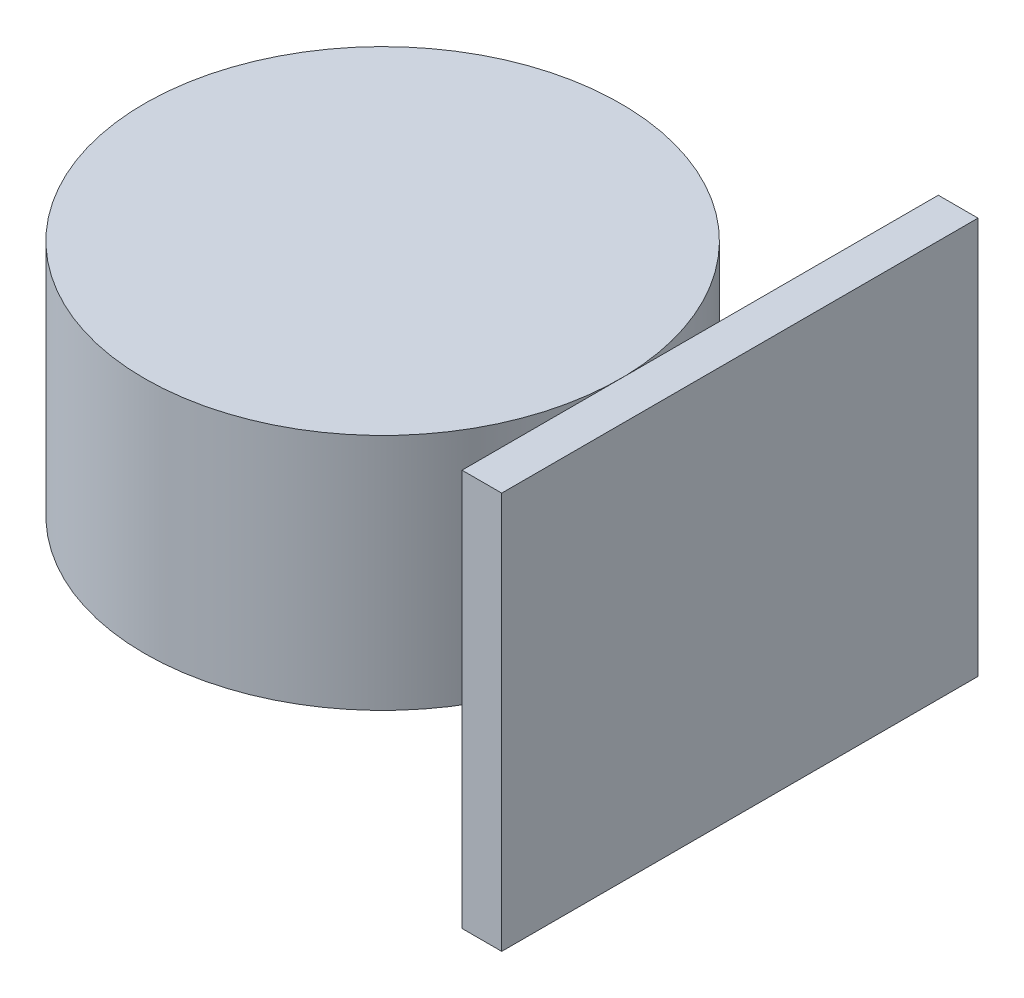
ISO-10303-21;
HEADER;
FILE_DESCRIPTION(('STEP AP214'),'2;1');
FILE_NAME('part.step','',(''),(''),'','','');
FILE_SCHEMA(('AUTOMOTIVE_DESIGN { 1 0 10303 214 1 1 1 1 }'));
ENDSEC;
DATA;
#1=APPLICATION_CONTEXT('core data for automotive mechanical design processes');
#2=APPLICATION_PROTOCOL_DEFINITION('international standard','automotive_design',2000,#1);
#3=PRODUCT_CONTEXT('',#1,'mechanical');
#4=PRODUCT('Part','Part','',(#3));
#5=PRODUCT_RELATED_PRODUCT_CATEGORY('part','',(#4));
#6=PRODUCT_DEFINITION_FORMATION('','',#4);
#7=PRODUCT_DEFINITION_CONTEXT('part definition',#1,'design');
#8=PRODUCT_DEFINITION('design','',#6,#7);
#9=PRODUCT_DEFINITION_SHAPE('','',#8);
#10=(LENGTH_UNIT() NAMED_UNIT(*) SI_UNIT(.MILLI.,.METRE.));
#11=(NAMED_UNIT(*) PLANE_ANGLE_UNIT() SI_UNIT($,.RADIAN.));
#12=(NAMED_UNIT(*) SI_UNIT($,.STERADIAN.) SOLID_ANGLE_UNIT());
#13=UNCERTAINTY_MEASURE_WITH_UNIT(LENGTH_MEASURE(1.E-05),#10,'distance_accuracy_value','');
#14=(GEOMETRIC_REPRESENTATION_CONTEXT(3) GLOBAL_UNCERTAINTY_ASSIGNED_CONTEXT((#13)) GLOBAL_UNIT_ASSIGNED_CONTEXT((#10,
#11,#12)) REPRESENTATION_CONTEXT('',''));
#15=CARTESIAN_POINT('',(0.,0.,0.));
#16=DIRECTION('',(0.,0.,1.));
#17=DIRECTION('',(1.,0.,0.));
#18=AXIS2_PLACEMENT_3D('',#15,#16,#17);
#19=CARTESIAN_POINT('',(0.,15.,0.));
#20=DIRECTION('',(0.,-1.,0.));
#21=DIRECTION('',(0.,0.,-1.));
#22=AXIS2_PLACEMENT_3D('',#19,#20,#21);
#23=CYLINDRICAL_SURFACE('',#22,30.);
#24=CARTESIAN_POINT('',(0.,-15.,0.));
#25=DIRECTION('',(0.,1.,0.));
#26=DIRECTION('',(0.,0.,1.));
#27=AXIS2_PLACEMENT_3D('',#24,#25,#26);
#28=CIRCLE('',#27,30.);
#29=CARTESIAN_POINT('',(0.,-15.,30.));
#30=VERTEX_POINT('',#29);
#31=EDGE_CURVE('E153',#30,#30,#28,.T.);
#32=ORIENTED_EDGE('',*,*,#31,.T.);
#33=EDGE_LOOP('',(#32));
#34=FACE_BOUND('',#33,.T.);
#35=CARTESIAN_POINT('',(0.,15.,0.));
#36=DIRECTION('',(0.,1.,0.));
#37=DIRECTION('',(0.,0.,1.));
#38=AXIS2_PLACEMENT_3D('',#35,#36,#37);
#39=CIRCLE('',#38,30.);
#40=CARTESIAN_POINT('',(0.,15.,30.));
#41=VERTEX_POINT('',#40);
#42=EDGE_CURVE('E154',#41,#41,#39,.T.);
#43=ORIENTED_EDGE('',*,*,#42,.F.);
#44=EDGE_LOOP('',(#43));
#45=FACE_BOUND('',#44,.T.);
#46=DIRECTION('',(0.,-1.,0.));
#47=VECTOR('',#46,1.);
#48=CARTESIAN_POINT('',(28.2842712474619,15.,-10.));
#49=LINE('',#48,#47);
#50=CARTESIAN_POINT('',(28.2842712474619,-10.,-10.));
#51=VERTEX_POINT('',#50);
#52=CARTESIAN_POINT('',(28.2842712474619,10.,-10.));
#53=VERTEX_POINT('',#52);
#54=EDGE_CURVE('E11',#51,#53,#49,.F.);
#55=ORIENTED_EDGE('',*,*,#54,.F.);
#56=CARTESIAN_POINT('',(0.,-10.,0.));
#57=DIRECTION('',(0.,1.,0.));
#58=DIRECTION('',(0.,0.,1.));
#59=AXIS2_PLACEMENT_3D('',#56,#57,#58);
#60=CIRCLE('',#59,30.);
#61=CARTESIAN_POINT('',(28.2842712474619,-10.,10.));
#62=VERTEX_POINT('',#61);
#63=EDGE_CURVE('E157',#62,#51,#60,.T.);
#64=ORIENTED_EDGE('',*,*,#63,.F.);
#65=DIRECTION('',(0.,-1.,0.));
#66=VECTOR('',#65,1.);
#67=CARTESIAN_POINT('',(28.2842712474619,15.,10.));
#68=LINE('',#67,#66);
#69=CARTESIAN_POINT('',(28.2842712474619,10.,10.));
#70=VERTEX_POINT('',#69);
#71=EDGE_CURVE('E56',#70,#62,#68,.T.);
#72=ORIENTED_EDGE('',*,*,#71,.F.);
#73=CARTESIAN_POINT('',(0.,10.,0.));
#74=DIRECTION('',(0.,-1.,0.));
#75=DIRECTION('',(0.,0.,-1.));
#76=AXIS2_PLACEMENT_3D('',#73,#74,#75);
#77=CIRCLE('',#76,30.);
#78=EDGE_CURVE('E46',#53,#70,#77,.T.);
#79=ORIENTED_EDGE('',*,*,#78,.F.);
#80=EDGE_LOOP('',(#55,#64,#72,#79));
#81=FACE_BOUND('',#80,.T.);
#82=ADVANCED_FACE('F39',(#34,#45,#81),#23,.T.);
#83=CARTESIAN_POINT('',(0.,15.,0.));
#84=DIRECTION('',(0.,1.,0.));
#85=DIRECTION('',(0.,0.,1.));
#86=AXIS2_PLACEMENT_3D('',#83,#84,#85);
#87=PLANE('',#86);
#88=ORIENTED_EDGE('',*,*,#42,.T.);
#89=EDGE_LOOP('',(#88));
#90=FACE_BOUND('',#89,.T.);
#91=ADVANCED_FACE('F187',(#90),#87,.T.);
#92=CARTESIAN_POINT('',(0.,-15.,0.));
#93=DIRECTION('',(0.,1.,0.));
#94=DIRECTION('',(0.,0.,1.));
#95=AXIS2_PLACEMENT_3D('',#92,#93,#94);
#96=PLANE('',#95);
#97=ORIENTED_EDGE('',*,*,#31,.F.);
#98=EDGE_LOOP('',(#97));
#99=FACE_BOUND('',#98,.T.);
#100=ADVANCED_FACE('F194',(#99),#96,.F.);
#101=CARTESIAN_POINT('',(40.,-10.,-10.));
#102=DIRECTION('',(0.,0.,1.));
#103=DIRECTION('',(1.,0.,0.));
#104=AXIS2_PLACEMENT_3D('',#101,#102,#103);
#105=PLANE('',#104);
#106=DIRECTION('',(-1.,0.,0.));
#107=VECTOR('',#106,1.);
#108=CARTESIAN_POINT('',(40.,-10.,-10.));
#109=LINE('',#108,#107);
#110=CARTESIAN_POINT('',(40.,-10.,-10.));
#111=VERTEX_POINT('',#110);
#112=EDGE_CURVE('E141',#111,#51,#109,.T.);
#113=ORIENTED_EDGE('',*,*,#112,.T.);
#114=ORIENTED_EDGE('',*,*,#54,.T.);
#115=DIRECTION('',(-1.,0.,0.));
#116=VECTOR('',#115,1.);
#117=CARTESIAN_POINT('',(40.,10.,-10.));
#118=LINE('',#117,#116);
#119=CARTESIAN_POINT('',(40.,10.,-10.));
#120=VERTEX_POINT('',#119);
#121=EDGE_CURVE('E150',#120,#53,#118,.T.);
#122=ORIENTED_EDGE('',*,*,#121,.F.);
#123=DIRECTION('',(0.,1.,0.));
#124=VECTOR('',#123,1.);
#125=CARTESIAN_POINT('',(40.,-10.,-10.));
#126=LINE('',#125,#124);
#127=EDGE_CURVE('E124',#111,#120,#126,.T.);
#128=ORIENTED_EDGE('',*,*,#127,.F.);
#129=EDGE_LOOP('',(#113,#114,#122,#128));
#130=FACE_BOUND('',#129,.T.);
#131=ADVANCED_FACE('F173',(#130),#105,.F.);
#132=CARTESIAN_POINT('',(40.,-10.,10.));
#133=DIRECTION('',(0.,0.,-1.));
#134=DIRECTION('',(-1.,0.,0.));
#135=AXIS2_PLACEMENT_3D('',#132,#133,#134);
#136=PLANE('',#135);
#137=DIRECTION('',(-1.,0.,0.));
#138=VECTOR('',#137,1.);
#139=CARTESIAN_POINT('',(40.,10.,10.));
#140=LINE('',#139,#138);
#141=CARTESIAN_POINT('',(40.,10.,10.));
#142=VERTEX_POINT('',#141);
#143=EDGE_CURVE('E147',#142,#70,#140,.T.);
#144=ORIENTED_EDGE('',*,*,#143,.T.);
#145=ORIENTED_EDGE('',*,*,#71,.T.);
#146=DIRECTION('',(-1.,0.,0.));
#147=VECTOR('',#146,1.);
#148=CARTESIAN_POINT('',(40.,-10.,10.));
#149=LINE('',#148,#147);
#150=CARTESIAN_POINT('',(40.,-10.,10.));
#151=VERTEX_POINT('',#150);
#152=EDGE_CURVE('E144',#151,#62,#149,.T.);
#153=ORIENTED_EDGE('',*,*,#152,.F.);
#154=DIRECTION('',(0.,-1.,0.));
#155=VECTOR('',#154,1.);
#156=CARTESIAN_POINT('',(40.,-10.,10.));
#157=LINE('',#156,#155);
#158=EDGE_CURVE('E135',#142,#151,#157,.T.);
#159=ORIENTED_EDGE('',*,*,#158,.F.);
#160=EDGE_LOOP('',(#144,#145,#153,#159));
#161=FACE_BOUND('',#160,.T.);
#162=ADVANCED_FACE('F167',(#161),#136,.F.);
#163=CARTESIAN_POINT('',(40.,10.,10.));
#164=DIRECTION('',(0.,-1.,0.));
#165=DIRECTION('',(0.,0.,-1.));
#166=AXIS2_PLACEMENT_3D('',#163,#164,#165);
#167=PLANE('',#166);
#168=ORIENTED_EDGE('',*,*,#121,.T.);
#169=ORIENTED_EDGE('',*,*,#78,.T.);
#170=ORIENTED_EDGE('',*,*,#143,.F.);
#171=DIRECTION('',(0.,0.,1.));
#172=VECTOR('',#171,1.);
#173=CARTESIAN_POINT('',(40.,10.,10.));
#174=LINE('',#173,#172);
#175=EDGE_CURVE('E127',#120,#142,#174,.T.);
#176=ORIENTED_EDGE('',*,*,#175,.F.);
#177=EDGE_LOOP('',(#168,#169,#170,#176));
#178=FACE_BOUND('',#177,.T.);
#179=ADVANCED_FACE('F163',(#178),#167,.F.);
#180=CARTESIAN_POINT('',(40.,-10.,10.));
#181=DIRECTION('',(0.,1.,0.));
#182=DIRECTION('',(0.,0.,1.));
#183=AXIS2_PLACEMENT_3D('',#180,#181,#182);
#184=PLANE('',#183);
#185=ORIENTED_EDGE('',*,*,#152,.T.);
#186=ORIENTED_EDGE('',*,*,#63,.T.);
#187=ORIENTED_EDGE('',*,*,#112,.F.);
#188=DIRECTION('',(0.,0.,-1.));
#189=VECTOR('',#188,1.);
#190=CARTESIAN_POINT('',(40.,-10.,10.));
#191=LINE('',#190,#189);
#192=EDGE_CURVE('E138',#151,#111,#191,.T.);
#193=ORIENTED_EDGE('',*,*,#192,.F.);
#194=EDGE_LOOP('',(#185,#186,#187,#193));
#195=FACE_BOUND('',#194,.T.);
#196=ADVANCED_FACE('F176',(#195),#184,.F.);
#197=CARTESIAN_POINT('',(45.,-25.,-30.));
#198=DIRECTION('',(0.,0.,1.));
#199=DIRECTION('',(1.,0.,0.));
#200=AXIS2_PLACEMENT_3D('',#197,#198,#199);
#201=PLANE('',#200);
#202=DIRECTION('',(0.,1.,0.));
#203=VECTOR('',#202,1.);
#204=CARTESIAN_POINT('',(40.,-25.,-30.));
#205=LINE('',#204,#203);
#206=CARTESIAN_POINT('',(40.,-25.,-30.));
#207=VERTEX_POINT('',#206);
#208=CARTESIAN_POINT('',(40.,25.,-30.));
#209=VERTEX_POINT('',#208);
#210=EDGE_CURVE('E123',#207,#209,#205,.T.);
#211=ORIENTED_EDGE('',*,*,#210,.T.);
#212=DIRECTION('',(-1.,0.,0.));
#213=VECTOR('',#212,1.);
#214=CARTESIAN_POINT('',(45.,25.,-30.));
#215=LINE('',#214,#213);
#216=CARTESIAN_POINT('',(45.,25.,-30.));
#217=VERTEX_POINT('',#216);
#218=EDGE_CURVE('E103',#217,#209,#215,.T.);
#219=ORIENTED_EDGE('',*,*,#218,.F.);
#220=DIRECTION('',(0.,1.,0.));
#221=VECTOR('',#220,1.);
#222=CARTESIAN_POINT('',(45.,-25.,-30.));
#223=LINE('',#222,#221);
#224=CARTESIAN_POINT('',(45.,-25.,-30.));
#225=VERTEX_POINT('',#224);
#226=EDGE_CURVE('E110',#225,#217,#223,.T.);
#227=ORIENTED_EDGE('',*,*,#226,.F.);
#228=DIRECTION('',(-1.,0.,0.));
#229=VECTOR('',#228,1.);
#230=CARTESIAN_POINT('',(45.,-25.,-30.));
#231=LINE('',#230,#229);
#232=EDGE_CURVE('E274',#225,#207,#231,.T.);
#233=ORIENTED_EDGE('',*,*,#232,.T.);
#234=EDGE_LOOP('',(#211,#219,#227,#233));
#235=FACE_BOUND('',#234,.T.);
#236=ADVANCED_FACE('F121',(#235),#201,.F.);
#237=CARTESIAN_POINT('',(45.,25.,30.));
#238=DIRECTION('',(0.,-1.,0.));
#239=DIRECTION('',(0.,0.,-1.));
#240=AXIS2_PLACEMENT_3D('',#237,#238,#239);
#241=PLANE('',#240);
#242=DIRECTION('',(0.,0.,1.));
#243=VECTOR('',#242,1.);
#244=CARTESIAN_POINT('',(40.,25.,30.));
#245=LINE('',#244,#243);
#246=CARTESIAN_POINT('',(40.,25.,30.));
#247=VERTEX_POINT('',#246);
#248=EDGE_CURVE('E280',#209,#247,#245,.T.);
#249=ORIENTED_EDGE('',*,*,#248,.T.);
#250=DIRECTION('',(-1.,0.,0.));
#251=VECTOR('',#250,1.);
#252=CARTESIAN_POINT('',(45.,25.,30.));
#253=LINE('',#252,#251);
#254=CARTESIAN_POINT('',(45.,25.,30.));
#255=VERTEX_POINT('',#254);
#256=EDGE_CURVE('E106',#255,#247,#253,.T.);
#257=ORIENTED_EDGE('',*,*,#256,.F.);
#258=DIRECTION('',(0.,0.,1.));
#259=VECTOR('',#258,1.);
#260=CARTESIAN_POINT('',(45.,25.,30.));
#261=LINE('',#260,#259);
#262=EDGE_CURVE('E99',#217,#255,#261,.T.);
#263=ORIENTED_EDGE('',*,*,#262,.F.);
#264=ORIENTED_EDGE('',*,*,#218,.T.);
#265=EDGE_LOOP('',(#249,#257,#263,#264));
#266=FACE_BOUND('',#265,.T.);
#267=ADVANCED_FACE('F101',(#266),#241,.F.);
#268=CARTESIAN_POINT('',(45.,-25.,30.));
#269=DIRECTION('',(0.,0.,-1.));
#270=DIRECTION('',(-1.,0.,0.));
#271=AXIS2_PLACEMENT_3D('',#268,#269,#270);
#272=PLANE('',#271);
#273=DIRECTION('',(0.,-1.,0.));
#274=VECTOR('',#273,1.);
#275=CARTESIAN_POINT('',(40.,-25.,30.));
#276=LINE('',#275,#274);
#277=CARTESIAN_POINT('',(40.,-25.,30.));
#278=VERTEX_POINT('',#277);
#279=EDGE_CURVE('E277',#247,#278,#276,.T.);
#280=ORIENTED_EDGE('',*,*,#279,.T.);
#281=DIRECTION('',(-1.,0.,0.));
#282=VECTOR('',#281,1.);
#283=CARTESIAN_POINT('',(45.,-25.,30.));
#284=LINE('',#283,#282);
#285=CARTESIAN_POINT('',(45.,-25.,30.));
#286=VERTEX_POINT('',#285);
#287=EDGE_CURVE('E129',#286,#278,#284,.T.);
#288=ORIENTED_EDGE('',*,*,#287,.F.);
#289=DIRECTION('',(0.,-1.,0.));
#290=VECTOR('',#289,1.);
#291=CARTESIAN_POINT('',(45.,-25.,30.));
#292=LINE('',#291,#290);
#293=EDGE_CURVE('E109',#255,#286,#292,.T.);
#294=ORIENTED_EDGE('',*,*,#293,.F.);
#295=ORIENTED_EDGE('',*,*,#256,.T.);
#296=EDGE_LOOP('',(#280,#288,#294,#295));
#297=FACE_BOUND('',#296,.T.);
#298=ADVANCED_FACE('F234',(#297),#272,.F.);
#299=CARTESIAN_POINT('',(45.,-25.,30.));
#300=DIRECTION('',(0.,1.,0.));
#301=DIRECTION('',(0.,0.,1.));
#302=AXIS2_PLACEMENT_3D('',#299,#300,#301);
#303=PLANE('',#302);
#304=DIRECTION('',(0.,0.,-1.));
#305=VECTOR('',#304,1.);
#306=CARTESIAN_POINT('',(40.,-25.,30.));
#307=LINE('',#306,#305);
#308=EDGE_CURVE('E119',#278,#207,#307,.T.);
#309=ORIENTED_EDGE('',*,*,#308,.T.);
#310=ORIENTED_EDGE('',*,*,#232,.F.);
#311=DIRECTION('',(0.,0.,-1.));
#312=VECTOR('',#311,1.);
#313=CARTESIAN_POINT('',(45.,-25.,30.));
#314=LINE('',#313,#312);
#315=EDGE_CURVE('E115',#286,#225,#314,.T.);
#316=ORIENTED_EDGE('',*,*,#315,.F.);
#317=ORIENTED_EDGE('',*,*,#287,.T.);
#318=EDGE_LOOP('',(#309,#310,#316,#317));
#319=FACE_BOUND('',#318,.T.);
#320=ADVANCED_FACE('F243',(#319),#303,.F.);
#321=CARTESIAN_POINT('',(45.,0.,0.));
#322=DIRECTION('',(-1.,0.,0.));
#323=DIRECTION('',(0.,0.,1.));
#324=AXIS2_PLACEMENT_3D('',#321,#322,#323);
#325=PLANE('',#324);
#326=ORIENTED_EDGE('',*,*,#226,.T.);
#327=ORIENTED_EDGE('',*,*,#262,.T.);
#328=ORIENTED_EDGE('',*,*,#293,.T.);
#329=ORIENTED_EDGE('',*,*,#315,.T.);
#330=EDGE_LOOP('',(#326,#327,#328,#329));
#331=FACE_BOUND('',#330,.T.);
#332=ADVANCED_FACE('F113',(#331),#325,.F.);
#333=CARTESIAN_POINT('',(40.,0.,0.));
#334=DIRECTION('',(-1.,0.,0.));
#335=DIRECTION('',(0.,0.,1.));
#336=AXIS2_PLACEMENT_3D('',#333,#334,#335);
#337=PLANE('',#336);
#338=ORIENTED_EDGE('',*,*,#192,.T.);
#339=ORIENTED_EDGE('',*,*,#127,.T.);
#340=ORIENTED_EDGE('',*,*,#175,.T.);
#341=ORIENTED_EDGE('',*,*,#158,.T.);
#342=EDGE_LOOP('',(#338,#339,#340,#341));
#343=FACE_BOUND('',#342,.T.);
#344=ORIENTED_EDGE('',*,*,#210,.F.);
#345=ORIENTED_EDGE('',*,*,#308,.F.);
#346=ORIENTED_EDGE('',*,*,#279,.F.);
#347=ORIENTED_EDGE('',*,*,#248,.F.);
#348=EDGE_LOOP('',(#344,#345,#346,#347));
#349=FACE_BOUND('',#348,.T.);
#350=ADVANCED_FACE('F170',(#343,#349),#337,.T.);
#351=CLOSED_SHELL('',(#82,#91,#100,#131,#162,#179,#196,#236,#267,#298,#320,#332,#350));
#352=MANIFOLD_SOLID_BREP('B2',#351);
#353=ADVANCED_BREP_SHAPE_REPRESENTATION('',(#18,#352),#14);
#354=SHAPE_DEFINITION_REPRESENTATION(#9,#353);
ENDSEC;
END-ISO-10303-21;
